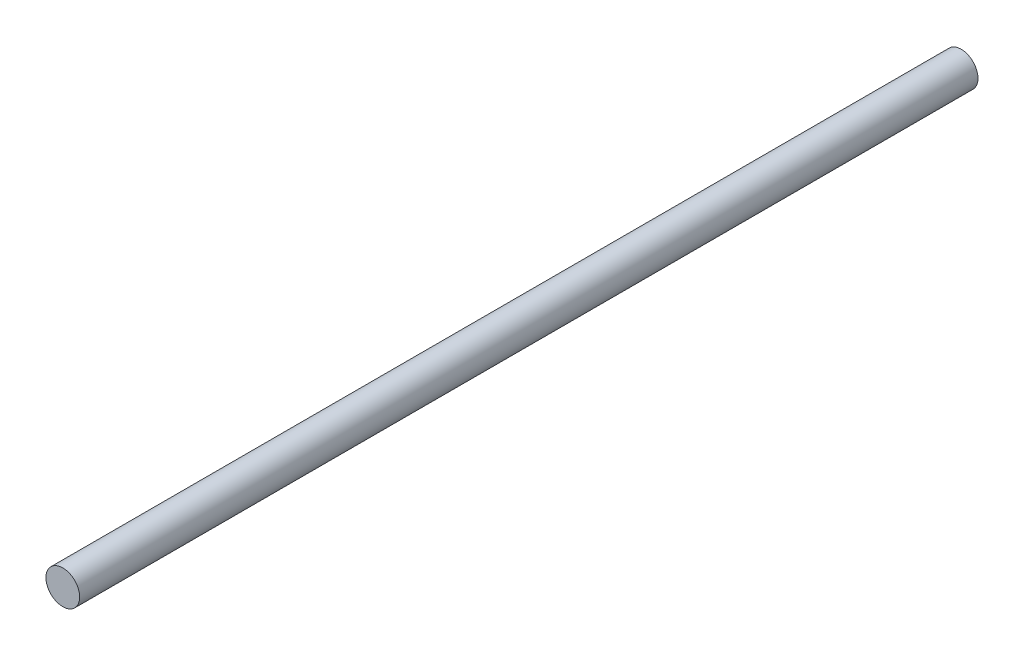
ISO-10303-21;
HEADER;
FILE_DESCRIPTION(('STEP AP214'),'2;1');
FILE_NAME('part.step','',(''),(''),'','','');
FILE_SCHEMA(('AUTOMOTIVE_DESIGN { 1 0 10303 214 1 1 1 1 }'));
ENDSEC;
DATA;
#1=APPLICATION_CONTEXT('core data for automotive mechanical design processes');
#2=APPLICATION_PROTOCOL_DEFINITION('international standard','automotive_design',2000,#1);
#3=PRODUCT_CONTEXT('',#1,'mechanical');
#4=PRODUCT('Part','Part','',(#3));
#5=PRODUCT_RELATED_PRODUCT_CATEGORY('part','',(#4));
#6=PRODUCT_DEFINITION_FORMATION('','',#4);
#7=PRODUCT_DEFINITION_CONTEXT('part definition',#1,'design');
#8=PRODUCT_DEFINITION('design','',#6,#7);
#9=PRODUCT_DEFINITION_SHAPE('','',#8);
#10=(LENGTH_UNIT() NAMED_UNIT(*) SI_UNIT(.MILLI.,.METRE.));
#11=(NAMED_UNIT(*) PLANE_ANGLE_UNIT() SI_UNIT($,.RADIAN.));
#12=(NAMED_UNIT(*) SI_UNIT($,.STERADIAN.) SOLID_ANGLE_UNIT());
#13=UNCERTAINTY_MEASURE_WITH_UNIT(LENGTH_MEASURE(1.E-05),#10,'distance_accuracy_value','');
#14=(GEOMETRIC_REPRESENTATION_CONTEXT(3) GLOBAL_UNCERTAINTY_ASSIGNED_CONTEXT((#13)) GLOBAL_UNIT_ASSIGNED_CONTEXT((#10,
#11,#12)) REPRESENTATION_CONTEXT('',''));
#15=CARTESIAN_POINT('',(0.,0.,0.));
#16=DIRECTION('',(0.,0.,1.));
#17=DIRECTION('',(1.,0.,0.));
#18=AXIS2_PLACEMENT_3D('',#15,#16,#17);
#19=CARTESIAN_POINT('',(0.,0.,800.));
#20=DIRECTION('',(0.,0.,-1.));
#21=DIRECTION('',(-1.,0.,0.));
#22=AXIS2_PLACEMENT_3D('',#19,#20,#21);
#23=CYLINDRICAL_SURFACE('',#22,15.);
#24=CARTESIAN_POINT('',(0.,0.,800.));
#25=DIRECTION('',(0.,0.,1.));
#26=DIRECTION('',(1.,0.,0.));
#27=AXIS2_PLACEMENT_3D('',#24,#25,#26);
#28=CIRCLE('',#27,15.);
#29=CARTESIAN_POINT('',(15.,0.,800.));
#30=VERTEX_POINT('',#29);
#31=EDGE_CURVE('E10',#30,#30,#28,.T.);
#32=ORIENTED_EDGE('',*,*,#31,.F.);
#33=EDGE_LOOP('',(#32));
#34=FACE_BOUND('',#33,.T.);
#35=CARTESIAN_POINT('',(0.,0.,0.));
#36=DIRECTION('',(0.,0.,1.));
#37=DIRECTION('',(1.,0.,0.));
#38=AXIS2_PLACEMENT_3D('',#35,#36,#37);
#39=CIRCLE('',#38,15.);
#40=CARTESIAN_POINT('',(15.,0.,0.));
#41=VERTEX_POINT('',#40);
#42=EDGE_CURVE('E34',#41,#41,#39,.T.);
#43=ORIENTED_EDGE('',*,*,#42,.T.);
#44=EDGE_LOOP('',(#43));
#45=FACE_BOUND('',#44,.T.);
#46=ADVANCED_FACE('F31',(#34,#45),#23,.T.);
#47=CARTESIAN_POINT('',(0.,0.,800.));
#48=DIRECTION('',(0.,0.,1.));
#49=DIRECTION('',(1.,0.,0.));
#50=AXIS2_PLACEMENT_3D('',#47,#48,#49);
#51=PLANE('',#50);
#52=ORIENTED_EDGE('',*,*,#31,.T.);
#53=EDGE_LOOP('',(#52));
#54=FACE_BOUND('',#53,.T.);
#55=ADVANCED_FACE('F46',(#54),#51,.T.);
#56=CARTESIAN_POINT('',(0.,0.,0.));
#57=DIRECTION('',(0.,0.,1.));
#58=DIRECTION('',(1.,0.,0.));
#59=AXIS2_PLACEMENT_3D('',#56,#57,#58);
#60=PLANE('',#59);
#61=ORIENTED_EDGE('',*,*,#42,.F.);
#62=EDGE_LOOP('',(#61));
#63=FACE_BOUND('',#62,.T.);
#64=ADVANCED_FACE('F44',(#63),#60,.F.);
#65=CLOSED_SHELL('',(#46,#55,#64));
#66=MANIFOLD_SOLID_BREP('B2',#65);
#67=ADVANCED_BREP_SHAPE_REPRESENTATION('',(#18,#66),#14);
#68=SHAPE_DEFINITION_REPRESENTATION(#9,#67);
ENDSEC;
END-ISO-10303-21;
